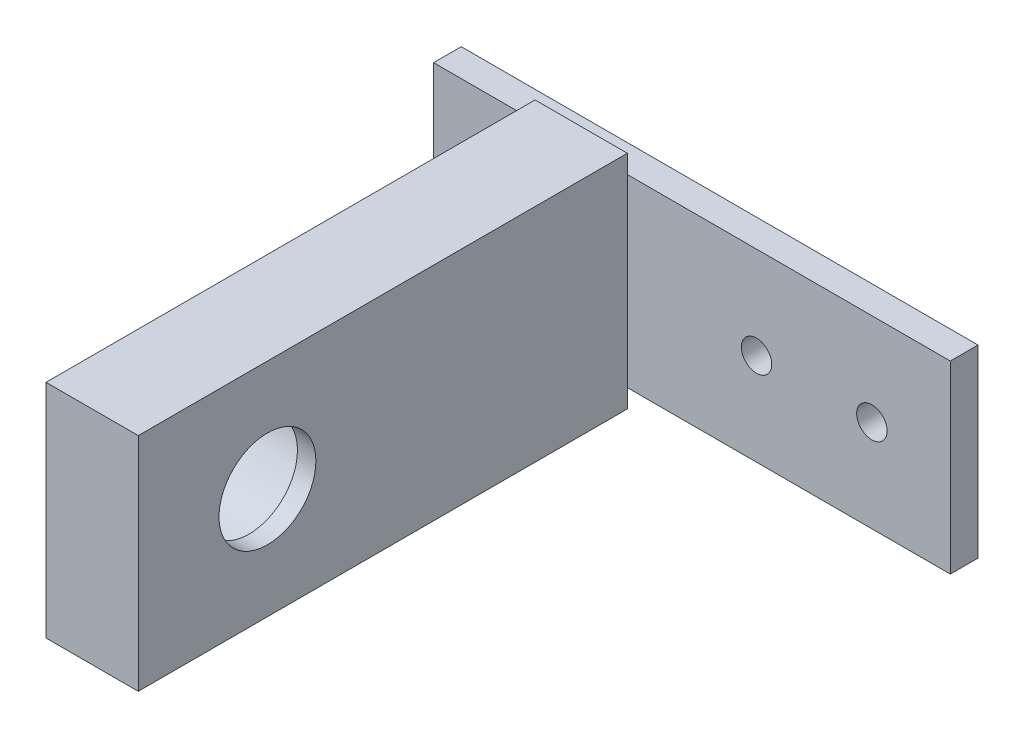
ISO-10303-21;
HEADER;
FILE_DESCRIPTION(('STEP AP214'),'2;1');
FILE_NAME('part.step','',(''),(''),'','','');
FILE_SCHEMA(('AUTOMOTIVE_DESIGN { 1 0 10303 214 1 1 1 1 }'));
ENDSEC;
DATA;
#1=APPLICATION_CONTEXT('core data for automotive mechanical design processes');
#2=APPLICATION_PROTOCOL_DEFINITION('international standard','automotive_design',2000,#1);
#3=PRODUCT_CONTEXT('',#1,'mechanical');
#4=PRODUCT('Part','Part','',(#3));
#5=PRODUCT_RELATED_PRODUCT_CATEGORY('part','',(#4));
#6=PRODUCT_DEFINITION_FORMATION('','',#4);
#7=PRODUCT_DEFINITION_CONTEXT('part definition',#1,'design');
#8=PRODUCT_DEFINITION('design','',#6,#7);
#9=PRODUCT_DEFINITION_SHAPE('','',#8);
#10=(LENGTH_UNIT() NAMED_UNIT(*) SI_UNIT(.MILLI.,.METRE.));
#11=(NAMED_UNIT(*) PLANE_ANGLE_UNIT() SI_UNIT($,.RADIAN.));
#12=(NAMED_UNIT(*) SI_UNIT($,.STERADIAN.) SOLID_ANGLE_UNIT());
#13=UNCERTAINTY_MEASURE_WITH_UNIT(LENGTH_MEASURE(1.E-05),#10,'distance_accuracy_value','');
#14=(GEOMETRIC_REPRESENTATION_CONTEXT(3) GLOBAL_UNCERTAINTY_ASSIGNED_CONTEXT((#13)) GLOBAL_UNIT_ASSIGNED_CONTEXT((#10,
#11,#12)) REPRESENTATION_CONTEXT('',''));
#15=CARTESIAN_POINT('',(0.,0.,0.));
#16=DIRECTION('',(0.,0.,1.));
#17=DIRECTION('',(1.,0.,0.));
#18=AXIS2_PLACEMENT_3D('',#15,#16,#17);
#19=CARTESIAN_POINT('',(12.,24.,0.002299999999991));
#20=DIRECTION('',(0.,0.,1.));
#21=DIRECTION('',(1.,0.,0.));
#22=AXIS2_PLACEMENT_3D('',#19,#20,#21);
#23=CYLINDRICAL_SURFACE('',#22,3.3);
#24=CARTESIAN_POINT('',(12.,24.,0.002299999999991));
#25=DIRECTION('',(0.,0.,1.));
#26=DIRECTION('',(1.,0.,0.));
#27=AXIS2_PLACEMENT_3D('',#24,#25,#26);
#28=CIRCLE('',#27,3.3);
#29=CARTESIAN_POINT('',(15.3,24.,0.002299999999991));
#30=VERTEX_POINT('',#29);
#31=EDGE_CURVE('E19',#30,#30,#28,.F.);
#32=ORIENTED_EDGE('',*,*,#31,.T.);
#33=EDGE_LOOP('',(#32));
#34=FACE_BOUND('',#33,.T.);
#35=CARTESIAN_POINT('',(12.,24.,6.0023));
#36=DIRECTION('',(0.,0.,1.));
#37=DIRECTION('',(1.,0.,0.));
#38=AXIS2_PLACEMENT_3D('',#35,#36,#37);
#39=CIRCLE('',#38,3.3);
#40=CARTESIAN_POINT('',(15.3,24.,6.0023));
#41=VERTEX_POINT('',#40);
#42=EDGE_CURVE('E121',#41,#41,#39,.F.);
#43=ORIENTED_EDGE('',*,*,#42,.F.);
#44=EDGE_LOOP('',(#43));
#45=FACE_BOUND('',#44,.T.);
#46=ADVANCED_FACE('F16',(#34,#45),#23,.F.);
#47=CARTESIAN_POINT('',(30.,44.,64.0023));
#48=DIRECTION('',(1.,0.,0.));
#49=DIRECTION('',(0.,0.,-1.));
#50=AXIS2_PLACEMENT_3D('',#47,#48,#49);
#51=PLANE('',#50);
#52=CARTESIAN_POINT('',(30.,44.,64.0023));
#53=DIRECTION('',(1.,0.,0.));
#54=DIRECTION('',(0.,0.,-1.));
#55=AXIS2_PLACEMENT_3D('',#52,#53,#54);
#56=CIRCLE('',#55,1.5);
#57=CARTESIAN_POINT('',(30.,44.,62.5023));
#58=VERTEX_POINT('',#57);
#59=EDGE_CURVE('E170',#58,#58,#56,.F.);
#60=ORIENTED_EDGE('',*,*,#59,.T.);
#61=EDGE_LOOP('',(#60));
#62=FACE_BOUND('',#61,.T.);
#63=ADVANCED_FACE('F179',(#62),#51,.F.);
#64=CARTESIAN_POINT('',(30.,44.,104.0023));
#65=DIRECTION('',(1.,0.,0.));
#66=DIRECTION('',(0.,0.,-1.));
#67=AXIS2_PLACEMENT_3D('',#64,#65,#66);
#68=PLANE('',#67);
#69=CARTESIAN_POINT('',(30.,44.,104.0023));
#70=DIRECTION('',(1.,0.,0.));
#71=DIRECTION('',(0.,0.,-1.));
#72=AXIS2_PLACEMENT_3D('',#69,#70,#71);
#73=CIRCLE('',#72,1.5);
#74=CARTESIAN_POINT('',(30.,44.,102.5023));
#75=VERTEX_POINT('',#74);
#76=EDGE_CURVE('E167',#75,#75,#73,.F.);
#77=ORIENTED_EDGE('',*,*,#76,.T.);
#78=EDGE_LOOP('',(#77));
#79=FACE_BOUND('',#78,.T.);
#80=ADVANCED_FACE('F185',(#79),#68,.F.);
#81=CARTESIAN_POINT('',(30.,4.,64.0023));
#82=DIRECTION('',(1.,0.,0.));
#83=DIRECTION('',(0.,0.,-1.));
#84=AXIS2_PLACEMENT_3D('',#81,#82,#83);
#85=PLANE('',#84);
#86=CARTESIAN_POINT('',(30.,4.,64.0023));
#87=DIRECTION('',(1.,0.,0.));
#88=DIRECTION('',(0.,0.,-1.));
#89=AXIS2_PLACEMENT_3D('',#86,#87,#88);
#90=CIRCLE('',#89,1.5);
#91=CARTESIAN_POINT('',(30.,4.,62.5023));
#92=VERTEX_POINT('',#91);
#93=EDGE_CURVE('E164',#92,#92,#90,.F.);
#94=ORIENTED_EDGE('',*,*,#93,.T.);
#95=EDGE_LOOP('',(#94));
#96=FACE_BOUND('',#95,.T.);
#97=ADVANCED_FACE('F279',(#96),#85,.F.);
#98=CARTESIAN_POINT('',(30.,4.,104.0023));
#99=DIRECTION('',(1.,0.,0.));
#100=DIRECTION('',(0.,0.,-1.));
#101=AXIS2_PLACEMENT_3D('',#98,#99,#100);
#102=PLANE('',#101);
#103=CARTESIAN_POINT('',(30.,4.,104.0023));
#104=DIRECTION('',(1.,0.,0.));
#105=DIRECTION('',(0.,0.,-1.));
#106=AXIS2_PLACEMENT_3D('',#103,#104,#105);
#107=CIRCLE('',#106,1.5);
#108=CARTESIAN_POINT('',(30.,4.,102.5023));
#109=VERTEX_POINT('',#108);
#110=EDGE_CURVE('E104',#109,#109,#107,.F.);
#111=ORIENTED_EDGE('',*,*,#110,.T.);
#112=EDGE_LOOP('',(#111));
#113=FACE_BOUND('',#112,.T.);
#114=ADVANCED_FACE('F275',(#113),#102,.F.);
#115=CARTESIAN_POINT('',(0.,4.,0.002299999999991));
#116=DIRECTION('',(0.,0.,1.));
#117=DIRECTION('',(1.,0.,0.));
#118=AXIS2_PLACEMENT_3D('',#115,#116,#117);
#119=PLANE('',#118);
#120=CARTESIAN_POINT('',(95.,24.,0.002299999999991));
#121=DIRECTION('',(0.,0.,1.));
#122=DIRECTION('',(1.,0.,0.));
#123=AXIS2_PLACEMENT_3D('',#120,#121,#122);
#124=CIRCLE('',#123,3.3);
#125=CARTESIAN_POINT('',(98.3,24.,0.002299999999991));
#126=VERTEX_POINT('',#125);
#127=EDGE_CURVE('E155',#126,#126,#124,.T.);
#128=ORIENTED_EDGE('',*,*,#127,.T.);
#129=EDGE_LOOP('',(#128));
#130=FACE_BOUND('',#129,.T.);
#131=CARTESIAN_POINT('',(70.,24.,0.002299999999991));
#132=DIRECTION('',(0.,0.,1.));
#133=DIRECTION('',(1.,0.,0.));
#134=AXIS2_PLACEMENT_3D('',#131,#132,#133);
#135=CIRCLE('',#134,3.3);
#136=CARTESIAN_POINT('',(73.3,24.,0.002299999999991));
#137=VERTEX_POINT('',#136);
#138=EDGE_CURVE('E159',#137,#137,#135,.T.);
#139=ORIENTED_EDGE('',*,*,#138,.T.);
#140=EDGE_LOOP('',(#139));
#141=FACE_BOUND('',#140,.T.);
#142=ORIENTED_EDGE('',*,*,#31,.F.);
#143=EDGE_LOOP('',(#142));
#144=FACE_BOUND('',#143,.T.);
#145=DIRECTION('',(0.,1.,0.));
#146=VECTOR('',#145,1.);
#147=CARTESIAN_POINT('',(112.,4.,0.002299999999991));
#148=LINE('',#147,#146);
#149=CARTESIAN_POINT('',(112.,4.,0.002299999999991));
#150=VERTEX_POINT('',#149);
#151=CARTESIAN_POINT('',(112.,44.,0.002299999999991));
#152=VERTEX_POINT('',#151);
#153=EDGE_CURVE('E101',#150,#152,#148,.T.);
#154=ORIENTED_EDGE('',*,*,#153,.F.);
#155=DIRECTION('',(1.,0.,0.));
#156=VECTOR('',#155,1.);
#157=CARTESIAN_POINT('',(0.,4.,0.002299999999991));
#158=LINE('',#157,#156);
#159=CARTESIAN_POINT('',(0.,4.,0.002299999999991));
#160=VERTEX_POINT('',#159);
#161=EDGE_CURVE('E96',#150,#160,#158,.F.);
#162=ORIENTED_EDGE('',*,*,#161,.T.);
#163=DIRECTION('',(0.,1.,0.));
#164=VECTOR('',#163,1.);
#165=CARTESIAN_POINT('',(0.,4.,0.002299999999991));
#166=LINE('',#165,#164);
#167=CARTESIAN_POINT('',(0.,44.,0.002299999999991));
#168=VERTEX_POINT('',#167);
#169=EDGE_CURVE('E98',#160,#168,#166,.T.);
#170=ORIENTED_EDGE('',*,*,#169,.T.);
#171=DIRECTION('',(1.,0.,0.));
#172=VECTOR('',#171,1.);
#173=CARTESIAN_POINT('',(0.,44.,0.002299999999991));
#174=LINE('',#173,#172);
#175=EDGE_CURVE('E158',#152,#168,#174,.F.);
#176=ORIENTED_EDGE('',*,*,#175,.F.);
#177=EDGE_LOOP('',(#154,#162,#170,#176));
#178=FACE_BOUND('',#177,.T.);
#179=ADVANCED_FACE('F97',(#130,#141,#144,#178),#119,.F.);
#180=CARTESIAN_POINT('',(0.,4.,0.002299999999991));
#181=DIRECTION('',(1.,0.,0.));
#182=DIRECTION('',(0.,0.,-1.));
#183=AXIS2_PLACEMENT_3D('',#180,#181,#182);
#184=PLANE('',#183);
#185=DIRECTION('',(0.,0.,1.));
#186=VECTOR('',#185,1.);
#187=CARTESIAN_POINT('',(0.,44.,0.002299999999991));
#188=LINE('',#187,#186);
#189=CARTESIAN_POINT('',(0.,44.,6.0023));
#190=VERTEX_POINT('',#189);
#191=EDGE_CURVE('E108',#168,#190,#188,.T.);
#192=ORIENTED_EDGE('',*,*,#191,.F.);
#193=ORIENTED_EDGE('',*,*,#169,.F.);
#194=DIRECTION('',(0.,0.,1.));
#195=VECTOR('',#194,1.);
#196=CARTESIAN_POINT('',(0.,4.,0.002299999999991));
#197=LINE('',#196,#195);
#198=CARTESIAN_POINT('',(0.,4.,6.0023));
#199=VERTEX_POINT('',#198);
#200=EDGE_CURVE('E91',#160,#199,#197,.T.);
#201=ORIENTED_EDGE('',*,*,#200,.T.);
#202=DIRECTION('',(0.,1.,0.));
#203=VECTOR('',#202,1.);
#204=CARTESIAN_POINT('',(0.,4.,6.0023));
#205=LINE('',#204,#203);
#206=EDGE_CURVE('E110',#190,#199,#205,.F.);
#207=ORIENTED_EDGE('',*,*,#206,.F.);
#208=EDGE_LOOP('',(#192,#193,#201,#207));
#209=FACE_BOUND('',#208,.T.);
#210=ADVANCED_FACE('F106',(#209),#184,.F.);
#211=CARTESIAN_POINT('',(0.,4.,6.0023));
#212=DIRECTION('',(0.,0.,1.));
#213=DIRECTION('',(1.,0.,0.));
#214=AXIS2_PLACEMENT_3D('',#211,#212,#213);
#215=PLANE('',#214);
#216=ORIENTED_EDGE('',*,*,#42,.T.);
#217=EDGE_LOOP('',(#216));
#218=FACE_BOUND('',#217,.T.);
#219=DIRECTION('',(1.,0.,0.));
#220=VECTOR('',#219,1.);
#221=CARTESIAN_POINT('',(0.,4.,6.0023));
#222=LINE('',#221,#220);
#223=CARTESIAN_POINT('',(22.,4.,6.0023));
#224=VERTEX_POINT('',#223);
#225=EDGE_CURVE('E115',#199,#224,#222,.T.);
#226=ORIENTED_EDGE('',*,*,#225,.T.);
#227=DIRECTION('',(0.,1.,0.));
#228=VECTOR('',#227,1.);
#229=CARTESIAN_POINT('',(22.,0.,6.0023));
#230=LINE('',#229,#228);
#231=CARTESIAN_POINT('',(22.,44.,6.0023));
#232=VERTEX_POINT('',#231);
#233=EDGE_CURVE('E154',#224,#232,#230,.T.);
#234=ORIENTED_EDGE('',*,*,#233,.T.);
#235=DIRECTION('',(1.,0.,0.));
#236=VECTOR('',#235,1.);
#237=CARTESIAN_POINT('',(0.,44.,6.0023));
#238=LINE('',#237,#236);
#239=EDGE_CURVE('E499',#190,#232,#238,.T.);
#240=ORIENTED_EDGE('',*,*,#239,.F.);
#241=ORIENTED_EDGE('',*,*,#206,.T.);
#242=EDGE_LOOP('',(#226,#234,#240,#241));
#243=FACE_BOUND('',#242,.T.);
#244=ADVANCED_FACE('F175',(#218,#243),#215,.T.);
#245=CARTESIAN_POINT('',(22.,44.,64.0023));
#246=DIRECTION('',(1.,0.,0.));
#247=DIRECTION('',(0.,0.,-1.));
#248=AXIS2_PLACEMENT_3D('',#245,#246,#247);
#249=CYLINDRICAL_SURFACE('',#248,1.5);
#250=CARTESIAN_POINT('',(22.,44.,64.0023));
#251=DIRECTION('',(1.,0.,0.));
#252=DIRECTION('',(0.,0.,-1.));
#253=AXIS2_PLACEMENT_3D('',#250,#251,#252);
#254=CIRCLE('',#253,1.5);
#255=CARTESIAN_POINT('',(22.,44.,62.5023));
#256=VERTEX_POINT('',#255);
#257=EDGE_CURVE('E151',#256,#256,#254,.F.);
#258=ORIENTED_EDGE('',*,*,#257,.T.);
#259=EDGE_LOOP('',(#258));
#260=FACE_BOUND('',#259,.T.);
#261=ORIENTED_EDGE('',*,*,#59,.F.);
#262=EDGE_LOOP('',(#261));
#263=FACE_BOUND('',#262,.T.);
#264=ADVANCED_FACE('F264',(#260,#263),#249,.F.);
#265=CARTESIAN_POINT('',(22.,44.,104.0023));
#266=DIRECTION('',(1.,0.,0.));
#267=DIRECTION('',(0.,0.,-1.));
#268=AXIS2_PLACEMENT_3D('',#265,#266,#267);
#269=CYLINDRICAL_SURFACE('',#268,1.5);
#270=CARTESIAN_POINT('',(22.,44.,104.0023));
#271=DIRECTION('',(1.,0.,0.));
#272=DIRECTION('',(0.,0.,-1.));
#273=AXIS2_PLACEMENT_3D('',#270,#271,#272);
#274=CIRCLE('',#273,1.5);
#275=CARTESIAN_POINT('',(22.,44.,102.5023));
#276=VERTEX_POINT('',#275);
#277=EDGE_CURVE('E148',#276,#276,#274,.F.);
#278=ORIENTED_EDGE('',*,*,#277,.T.);
#279=EDGE_LOOP('',(#278));
#280=FACE_BOUND('',#279,.T.);
#281=ORIENTED_EDGE('',*,*,#76,.F.);
#282=EDGE_LOOP('',(#281));
#283=FACE_BOUND('',#282,.T.);
#284=ADVANCED_FACE('F260',(#280,#283),#269,.F.);
#285=CARTESIAN_POINT('',(22.,4.,64.0023));
#286=DIRECTION('',(1.,0.,0.));
#287=DIRECTION('',(0.,0.,-1.));
#288=AXIS2_PLACEMENT_3D('',#285,#286,#287);
#289=CYLINDRICAL_SURFACE('',#288,1.5);
#290=CARTESIAN_POINT('',(22.,4.,64.0023));
#291=DIRECTION('',(1.,0.,0.));
#292=DIRECTION('',(0.,0.,-1.));
#293=AXIS2_PLACEMENT_3D('',#290,#291,#292);
#294=CIRCLE('',#293,1.5);
#295=CARTESIAN_POINT('',(22.,4.,62.5023));
#296=VERTEX_POINT('',#295);
#297=EDGE_CURVE('E145',#296,#296,#294,.F.);
#298=ORIENTED_EDGE('',*,*,#297,.T.);
#299=EDGE_LOOP('',(#298));
#300=FACE_BOUND('',#299,.T.);
#301=ORIENTED_EDGE('',*,*,#93,.F.);
#302=EDGE_LOOP('',(#301));
#303=FACE_BOUND('',#302,.T.);
#304=ADVANCED_FACE('F256',(#300,#303),#289,.F.);
#305=CARTESIAN_POINT('',(22.,4.,104.0023));
#306=DIRECTION('',(1.,0.,0.));
#307=DIRECTION('',(0.,0.,-1.));
#308=AXIS2_PLACEMENT_3D('',#305,#306,#307);
#309=CYLINDRICAL_SURFACE('',#308,1.5);
#310=CARTESIAN_POINT('',(22.,4.,104.0023));
#311=DIRECTION('',(1.,0.,0.));
#312=DIRECTION('',(0.,0.,-1.));
#313=AXIS2_PLACEMENT_3D('',#310,#311,#312);
#314=CIRCLE('',#313,1.5);
#315=CARTESIAN_POINT('',(22.,4.,102.5023));
#316=VERTEX_POINT('',#315);
#317=EDGE_CURVE('E139',#316,#316,#314,.F.);
#318=ORIENTED_EDGE('',*,*,#317,.T.);
#319=EDGE_LOOP('',(#318));
#320=FACE_BOUND('',#319,.T.);
#321=ORIENTED_EDGE('',*,*,#110,.F.);
#322=EDGE_LOOP('',(#321));
#323=FACE_BOUND('',#322,.T.);
#324=ADVANCED_FACE('F252',(#320,#323),#309,.F.);
#325=CARTESIAN_POINT('',(22.,24.,84.0023));
#326=DIRECTION('',(1.,0.,0.));
#327=DIRECTION('',(0.,0.,-1.));
#328=AXIS2_PLACEMENT_3D('',#325,#326,#327);
#329=CYLINDRICAL_SURFACE('',#328,17.5);
#330=CARTESIAN_POINT('',(22.,24.,84.0023));
#331=DIRECTION('',(1.,0.,0.));
#332=DIRECTION('',(0.,0.,-1.));
#333=AXIS2_PLACEMENT_3D('',#330,#331,#332);
#334=CIRCLE('',#333,17.5);
#335=CARTESIAN_POINT('',(22.,24.,66.5023));
#336=VERTEX_POINT('',#335);
#337=EDGE_CURVE('E142',#336,#336,#334,.F.);
#338=ORIENTED_EDGE('',*,*,#337,.T.);
#339=EDGE_LOOP('',(#338));
#340=FACE_BOUND('',#339,.T.);
#341=CARTESIAN_POINT('',(38.,24.,84.0023));
#342=DIRECTION('',(1.,0.,0.));
#343=DIRECTION('',(0.,0.,-1.));
#344=AXIS2_PLACEMENT_3D('',#341,#342,#343);
#345=CIRCLE('',#344,17.5);
#346=CARTESIAN_POINT('',(38.,24.,66.5023));
#347=VERTEX_POINT('',#346);
#348=EDGE_CURVE('E135',#347,#347,#345,.T.);
#349=ORIENTED_EDGE('',*,*,#348,.T.);
#350=EDGE_LOOP('',(#349));
#351=FACE_BOUND('',#350,.T.);
#352=ADVANCED_FACE('F249',(#340,#351),#329,.F.);
#353=CARTESIAN_POINT('',(0.,4.,0.002299999999991));
#354=DIRECTION('',(0.,1.,0.));
#355=DIRECTION('',(0.,0.,1.));
#356=AXIS2_PLACEMENT_3D('',#353,#354,#355);
#357=PLANE('',#356);
#358=DIRECTION('',(1.,0.,0.));
#359=VECTOR('',#358,1.);
#360=CARTESIAN_POINT('',(0.,4.,6.0023));
#361=LINE('',#360,#359);
#362=CARTESIAN_POINT('',(42.,4.,6.0023));
#363=VERTEX_POINT('',#362);
#364=CARTESIAN_POINT('',(112.,4.,6.0023));
#365=VERTEX_POINT('',#364);
#366=EDGE_CURVE('E475',#363,#365,#361,.T.);
#367=ORIENTED_EDGE('',*,*,#366,.F.);
#368=DIRECTION('',(1.,0.,0.));
#369=VECTOR('',#368,1.);
#370=CARTESIAN_POINT('',(22.,4.,6.0023));
#371=LINE('',#370,#369);
#372=EDGE_CURVE('E485',#363,#224,#371,.F.);
#373=ORIENTED_EDGE('',*,*,#372,.T.);
#374=ORIENTED_EDGE('',*,*,#225,.F.);
#375=ORIENTED_EDGE('',*,*,#200,.F.);
#376=ORIENTED_EDGE('',*,*,#161,.F.);
#377=DIRECTION('',(0.,0.,-1.));
#378=VECTOR('',#377,1.);
#379=CARTESIAN_POINT('',(112.,4.,0.002299999999991));
#380=LINE('',#379,#378);
#381=EDGE_CURVE('E117',#365,#150,#380,.T.);
#382=ORIENTED_EDGE('',*,*,#381,.F.);
#383=EDGE_LOOP('',(#367,#373,#374,#375,#376,#382));
#384=FACE_BOUND('',#383,.T.);
#385=ADVANCED_FACE('F113',(#384),#357,.F.);
#386=CARTESIAN_POINT('',(112.,4.,0.002299999999991));
#387=DIRECTION('',(1.,0.,0.));
#388=DIRECTION('',(0.,0.,-1.));
#389=AXIS2_PLACEMENT_3D('',#386,#387,#388);
#390=PLANE('',#389);
#391=DIRECTION('',(0.,0.,1.));
#392=VECTOR('',#391,1.);
#393=CARTESIAN_POINT('',(112.,44.,0.002299999999991));
#394=LINE('',#393,#392);
#395=CARTESIAN_POINT('',(112.,44.,6.0023));
#396=VERTEX_POINT('',#395);
#397=EDGE_CURVE('E496',#396,#152,#394,.F.);
#398=ORIENTED_EDGE('',*,*,#397,.F.);
#399=DIRECTION('',(0.,1.,0.));
#400=VECTOR('',#399,1.);
#401=CARTESIAN_POINT('',(112.,4.,6.0023));
#402=LINE('',#401,#400);
#403=EDGE_CURVE('E134',#365,#396,#402,.T.);
#404=ORIENTED_EDGE('',*,*,#403,.F.);
#405=ORIENTED_EDGE('',*,*,#381,.T.);
#406=ORIENTED_EDGE('',*,*,#153,.T.);
#407=EDGE_LOOP('',(#398,#404,#405,#406));
#408=FACE_BOUND('',#407,.T.);
#409=ADVANCED_FACE('F242',(#408),#390,.T.);
#410=CARTESIAN_POINT('',(70.,24.,0.002299999999991));
#411=DIRECTION('',(0.,0.,1.));
#412=DIRECTION('',(1.,0.,0.));
#413=AXIS2_PLACEMENT_3D('',#410,#411,#412);
#414=CYLINDRICAL_SURFACE('',#413,3.3);
#415=ORIENTED_EDGE('',*,*,#138,.F.);
#416=EDGE_LOOP('',(#415));
#417=FACE_BOUND('',#416,.T.);
#418=CARTESIAN_POINT('',(70.,24.,6.0023));
#419=DIRECTION('',(0.,0.,1.));
#420=DIRECTION('',(1.,0.,0.));
#421=AXIS2_PLACEMENT_3D('',#418,#419,#420);
#422=CIRCLE('',#421,3.3);
#423=CARTESIAN_POINT('',(73.3,24.,6.0023));
#424=VERTEX_POINT('',#423);
#425=EDGE_CURVE('E131',#424,#424,#422,.F.);
#426=ORIENTED_EDGE('',*,*,#425,.F.);
#427=EDGE_LOOP('',(#426));
#428=FACE_BOUND('',#427,.T.);
#429=ADVANCED_FACE('F238',(#417,#428),#414,.F.);
#430=CARTESIAN_POINT('',(95.,24.,0.002299999999991));
#431=DIRECTION('',(0.,0.,1.));
#432=DIRECTION('',(1.,0.,0.));
#433=AXIS2_PLACEMENT_3D('',#430,#431,#432);
#434=CYLINDRICAL_SURFACE('',#433,3.3);
#435=ORIENTED_EDGE('',*,*,#127,.F.);
#436=EDGE_LOOP('',(#435));
#437=FACE_BOUND('',#436,.T.);
#438=CARTESIAN_POINT('',(95.,24.,6.0023));
#439=DIRECTION('',(0.,0.,1.));
#440=DIRECTION('',(1.,0.,0.));
#441=AXIS2_PLACEMENT_3D('',#438,#439,#440);
#442=CIRCLE('',#441,3.3);
#443=CARTESIAN_POINT('',(98.3,24.,6.0023));
#444=VERTEX_POINT('',#443);
#445=EDGE_CURVE('E127',#444,#444,#442,.F.);
#446=ORIENTED_EDGE('',*,*,#445,.F.);
#447=EDGE_LOOP('',(#446));
#448=FACE_BOUND('',#447,.T.);
#449=ADVANCED_FACE('F234',(#437,#448),#434,.F.);
#450=CARTESIAN_POINT('',(0.,44.,0.002299999999991));
#451=DIRECTION('',(0.,1.,0.));
#452=DIRECTION('',(0.,0.,1.));
#453=AXIS2_PLACEMENT_3D('',#450,#451,#452);
#454=PLANE('',#453);
#455=DIRECTION('',(1.,0.,0.));
#456=VECTOR('',#455,1.);
#457=CARTESIAN_POINT('',(0.,44.,6.0023));
#458=LINE('',#457,#456);
#459=CARTESIAN_POINT('',(42.,44.,6.0023));
#460=VERTEX_POINT('',#459);
#461=EDGE_CURVE('E482',#396,#460,#458,.F.);
#462=ORIENTED_EDGE('',*,*,#461,.F.);
#463=ORIENTED_EDGE('',*,*,#397,.T.);
#464=ORIENTED_EDGE('',*,*,#175,.T.);
#465=ORIENTED_EDGE('',*,*,#191,.T.);
#466=ORIENTED_EDGE('',*,*,#239,.T.);
#467=DIRECTION('',(1.,0.,0.));
#468=VECTOR('',#467,1.);
#469=CARTESIAN_POINT('',(22.,44.,6.0023));
#470=LINE('',#469,#468);
#471=EDGE_CURVE('E506',#232,#460,#470,.T.);
#472=ORIENTED_EDGE('',*,*,#471,.T.);
#473=EDGE_LOOP('',(#462,#463,#464,#465,#466,#472));
#474=FACE_BOUND('',#473,.T.);
#475=ADVANCED_FACE('F230',(#474),#454,.T.);
#476=CARTESIAN_POINT('',(22.,0.,6.0023));
#477=DIRECTION('',(1.,0.,0.));
#478=DIRECTION('',(0.,0.,-1.));
#479=AXIS2_PLACEMENT_3D('',#476,#477,#478);
#480=PLANE('',#479);
#481=ORIENTED_EDGE('',*,*,#317,.F.);
#482=EDGE_LOOP('',(#481));
#483=FACE_BOUND('',#482,.T.);
#484=ORIENTED_EDGE('',*,*,#337,.F.);
#485=EDGE_LOOP('',(#484));
#486=FACE_BOUND('',#485,.T.);
#487=ORIENTED_EDGE('',*,*,#297,.F.);
#488=EDGE_LOOP('',(#487));
#489=FACE_BOUND('',#488,.T.);
#490=ORIENTED_EDGE('',*,*,#277,.F.);
#491=EDGE_LOOP('',(#490));
#492=FACE_BOUND('',#491,.T.);
#493=ORIENTED_EDGE('',*,*,#257,.F.);
#494=EDGE_LOOP('',(#493));
#495=FACE_BOUND('',#494,.T.);
#496=DIRECTION('',(0.,0.,1.));
#497=VECTOR('',#496,1.);
#498=CARTESIAN_POINT('',(22.,48.,6.0023));
#499=LINE('',#498,#497);
#500=CARTESIAN_POINT('',(22.,48.,6.0023));
#501=VERTEX_POINT('',#500);
#502=CARTESIAN_POINT('',(22.,48.,112.0023));
#503=VERTEX_POINT('',#502);
#504=EDGE_CURVE('E530',#501,#503,#499,.T.);
#505=ORIENTED_EDGE('',*,*,#504,.F.);
#506=DIRECTION('',(0.,1.,0.));
#507=VECTOR('',#506,1.);
#508=CARTESIAN_POINT('',(22.,0.,6.0023));
#509=LINE('',#508,#507);
#510=EDGE_CURVE('E130',#501,#232,#509,.F.);
#511=ORIENTED_EDGE('',*,*,#510,.T.);
#512=ORIENTED_EDGE('',*,*,#233,.F.);
#513=DIRECTION('',(0.,1.,0.));
#514=VECTOR('',#513,1.);
#515=CARTESIAN_POINT('',(22.,0.,6.0023));
#516=LINE('',#515,#514);
#517=CARTESIAN_POINT('',(22.,0.,6.0023));
#518=VERTEX_POINT('',#517);
#519=EDGE_CURVE('E492',#224,#518,#516,.F.);
#520=ORIENTED_EDGE('',*,*,#519,.T.);
#521=DIRECTION('',(0.,0.,1.));
#522=VECTOR('',#521,1.);
#523=CARTESIAN_POINT('',(22.,0.,6.0023));
#524=LINE('',#523,#522);
#525=CARTESIAN_POINT('',(22.,0.,112.0023));
#526=VERTEX_POINT('',#525);
#527=EDGE_CURVE('E138',#518,#526,#524,.T.);
#528=ORIENTED_EDGE('',*,*,#527,.T.);
#529=DIRECTION('',(0.,1.,0.));
#530=VECTOR('',#529,1.);
#531=CARTESIAN_POINT('',(22.,0.,112.0023));
#532=LINE('',#531,#530);
#533=EDGE_CURVE('E527',#503,#526,#532,.F.);
#534=ORIENTED_EDGE('',*,*,#533,.F.);
#535=EDGE_LOOP('',(#505,#511,#512,#520,#528,#534));
#536=FACE_BOUND('',#535,.T.);
#537=ADVANCED_FACE('F226',(#483,#486,#489,#492,#495,#536),#480,.F.);
#538=CARTESIAN_POINT('',(38.,24.,84.0023));
#539=DIRECTION('',(1.,0.,0.));
#540=DIRECTION('',(0.,0.,-1.));
#541=AXIS2_PLACEMENT_3D('',#538,#539,#540);
#542=PLANE('',#541);
#543=CARTESIAN_POINT('',(38.,24.,84.0023));
#544=DIRECTION('',(1.,0.,0.));
#545=DIRECTION('',(0.,0.,-1.));
#546=AXIS2_PLACEMENT_3D('',#543,#544,#545);
#547=CIRCLE('',#546,10.5);
#548=CARTESIAN_POINT('',(38.,24.,73.5023));
#549=VERTEX_POINT('',#548);
#550=EDGE_CURVE('E123',#549,#549,#547,.T.);
#551=ORIENTED_EDGE('',*,*,#550,.T.);
#552=EDGE_LOOP('',(#551));
#553=FACE_BOUND('',#552,.T.);
#554=ORIENTED_EDGE('',*,*,#348,.F.);
#555=EDGE_LOOP('',(#554));
#556=FACE_BOUND('',#555,.T.);
#557=ADVANCED_FACE('F222',(#553,#556),#542,.F.);
#558=CARTESIAN_POINT('',(22.,0.,6.0023));
#559=DIRECTION('',(0.,1.,0.));
#560=DIRECTION('',(0.,0.,1.));
#561=AXIS2_PLACEMENT_3D('',#558,#559,#560);
#562=PLANE('',#561);
#563=DIRECTION('',(1.,0.,0.));
#564=VECTOR('',#563,1.);
#565=CARTESIAN_POINT('',(22.,0.,112.0023));
#566=LINE('',#565,#564);
#567=CARTESIAN_POINT('',(42.,0.,112.0023));
#568=VERTEX_POINT('',#567);
#569=EDGE_CURVE('E524',#526,#568,#566,.T.);
#570=ORIENTED_EDGE('',*,*,#569,.F.);
#571=ORIENTED_EDGE('',*,*,#527,.F.);
#572=DIRECTION('',(1.,0.,0.));
#573=VECTOR('',#572,1.);
#574=CARTESIAN_POINT('',(22.,0.,6.0023));
#575=LINE('',#574,#573);
#576=CARTESIAN_POINT('',(42.,0.,6.0023));
#577=VERTEX_POINT('',#576);
#578=EDGE_CURVE('E490',#518,#577,#575,.T.);
#579=ORIENTED_EDGE('',*,*,#578,.T.);
#580=DIRECTION('',(0.,0.,-1.));
#581=VECTOR('',#580,1.);
#582=CARTESIAN_POINT('',(42.,0.,6.0023));
#583=LINE('',#582,#581);
#584=EDGE_CURVE('E126',#568,#577,#583,.T.);
#585=ORIENTED_EDGE('',*,*,#584,.F.);
#586=EDGE_LOOP('',(#570,#571,#579,#585));
#587=FACE_BOUND('',#586,.T.);
#588=ADVANCED_FACE('F218',(#587),#562,.F.);
#589=CARTESIAN_POINT('',(22.,0.,6.0023));
#590=DIRECTION('',(0.,0.,1.));
#591=DIRECTION('',(1.,0.,0.));
#592=AXIS2_PLACEMENT_3D('',#589,#590,#591);
#593=PLANE('',#592);
#594=DIRECTION('',(0.,1.,0.));
#595=VECTOR('',#594,1.);
#596=CARTESIAN_POINT('',(42.,0.,6.0023));
#597=LINE('',#596,#595);
#598=EDGE_CURVE('E517',#577,#363,#597,.T.);
#599=ORIENTED_EDGE('',*,*,#598,.F.);
#600=ORIENTED_EDGE('',*,*,#578,.F.);
#601=ORIENTED_EDGE('',*,*,#519,.F.);
#602=ORIENTED_EDGE('',*,*,#372,.F.);
#603=EDGE_LOOP('',(#599,#600,#601,#602));
#604=FACE_BOUND('',#603,.T.);
#605=ADVANCED_FACE('F214',(#604),#593,.F.);
#606=CARTESIAN_POINT('',(0.,4.,6.0023));
#607=DIRECTION('',(0.,0.,1.));
#608=DIRECTION('',(1.,0.,0.));
#609=AXIS2_PLACEMENT_3D('',#606,#607,#608);
#610=PLANE('',#609);
#611=ORIENTED_EDGE('',*,*,#445,.T.);
#612=EDGE_LOOP('',(#611));
#613=FACE_BOUND('',#612,.T.);
#614=ORIENTED_EDGE('',*,*,#425,.T.);
#615=EDGE_LOOP('',(#614));
#616=FACE_BOUND('',#615,.T.);
#617=ORIENTED_EDGE('',*,*,#366,.T.);
#618=ORIENTED_EDGE('',*,*,#403,.T.);
#619=ORIENTED_EDGE('',*,*,#461,.T.);
#620=DIRECTION('',(0.,1.,0.));
#621=VECTOR('',#620,1.);
#622=CARTESIAN_POINT('',(42.,0.,6.0023));
#623=LINE('',#622,#621);
#624=EDGE_CURVE('E479',#363,#460,#623,.T.);
#625=ORIENTED_EDGE('',*,*,#624,.F.);
#626=EDGE_LOOP('',(#617,#618,#619,#625));
#627=FACE_BOUND('',#626,.T.);
#628=ADVANCED_FACE('F210',(#613,#616,#627),#610,.T.);
#629=CARTESIAN_POINT('',(22.,0.,6.0023));
#630=DIRECTION('',(0.,0.,1.));
#631=DIRECTION('',(1.,0.,0.));
#632=AXIS2_PLACEMENT_3D('',#629,#630,#631);
#633=PLANE('',#632);
#634=DIRECTION('',(0.,1.,0.));
#635=VECTOR('',#634,1.);
#636=CARTESIAN_POINT('',(42.,0.,6.0023));
#637=LINE('',#636,#635);
#638=CARTESIAN_POINT('',(42.,48.,6.0023));
#639=VERTEX_POINT('',#638);
#640=EDGE_CURVE('E509',#460,#639,#637,.T.);
#641=ORIENTED_EDGE('',*,*,#640,.F.);
#642=ORIENTED_EDGE('',*,*,#471,.F.);
#643=ORIENTED_EDGE('',*,*,#510,.F.);
#644=DIRECTION('',(1.,0.,0.));
#645=VECTOR('',#644,1.);
#646=CARTESIAN_POINT('',(22.,48.,6.0023));
#647=LINE('',#646,#645);
#648=EDGE_CURVE('E511',#639,#501,#647,.F.);
#649=ORIENTED_EDGE('',*,*,#648,.F.);
#650=EDGE_LOOP('',(#641,#642,#643,#649));
#651=FACE_BOUND('',#650,.T.);
#652=ADVANCED_FACE('F207',(#651),#633,.F.);
#653=CARTESIAN_POINT('',(22.,48.,6.0023));
#654=DIRECTION('',(0.,1.,0.));
#655=DIRECTION('',(0.,0.,1.));
#656=AXIS2_PLACEMENT_3D('',#653,#654,#655);
#657=PLANE('',#656);
#658=DIRECTION('',(1.,0.,0.));
#659=VECTOR('',#658,1.);
#660=CARTESIAN_POINT('',(22.,48.,112.0023));
#661=LINE('',#660,#659);
#662=CARTESIAN_POINT('',(42.,48.,112.0023));
#663=VERTEX_POINT('',#662);
#664=EDGE_CURVE('E34',#663,#503,#661,.F.);
#665=ORIENTED_EDGE('',*,*,#664,.F.);
#666=DIRECTION('',(0.,0.,-1.));
#667=VECTOR('',#666,1.);
#668=CARTESIAN_POINT('',(42.,48.,6.0023));
#669=LINE('',#668,#667);
#670=EDGE_CURVE('E513',#639,#663,#669,.F.);
#671=ORIENTED_EDGE('',*,*,#670,.F.);
#672=ORIENTED_EDGE('',*,*,#648,.T.);
#673=ORIENTED_EDGE('',*,*,#504,.T.);
#674=EDGE_LOOP('',(#665,#671,#672,#673));
#675=FACE_BOUND('',#674,.T.);
#676=ADVANCED_FACE('F203',(#675),#657,.T.);
#677=CARTESIAN_POINT('',(22.,0.,112.0023));
#678=DIRECTION('',(0.,0.,1.));
#679=DIRECTION('',(1.,0.,0.));
#680=AXIS2_PLACEMENT_3D('',#677,#678,#679);
#681=PLANE('',#680);
#682=DIRECTION('',(0.,1.,0.));
#683=VECTOR('',#682,1.);
#684=CARTESIAN_POINT('',(42.,0.,112.0023));
#685=LINE('',#684,#683);
#686=EDGE_CURVE('E25',#663,#568,#685,.F.);
#687=ORIENTED_EDGE('',*,*,#686,.F.);
#688=ORIENTED_EDGE('',*,*,#664,.T.);
#689=ORIENTED_EDGE('',*,*,#533,.T.);
#690=ORIENTED_EDGE('',*,*,#569,.T.);
#691=EDGE_LOOP('',(#687,#688,#689,#690));
#692=FACE_BOUND('',#691,.T.);
#693=ADVANCED_FACE('F196',(#692),#681,.T.);
#694=CARTESIAN_POINT('',(22.,24.,84.0023));
#695=DIRECTION('',(1.,0.,0.));
#696=DIRECTION('',(0.,0.,-1.));
#697=AXIS2_PLACEMENT_3D('',#694,#695,#696);
#698=CYLINDRICAL_SURFACE('',#697,10.5);
#699=CARTESIAN_POINT('',(42.,24.,84.0023));
#700=DIRECTION('',(1.,0.,0.));
#701=DIRECTION('',(0.,0.,-1.));
#702=AXIS2_PLACEMENT_3D('',#699,#700,#701);
#703=CIRCLE('',#702,10.5);
#704=CARTESIAN_POINT('',(42.,24.,73.5023));
#705=VERTEX_POINT('',#704);
#706=EDGE_CURVE('E11',#705,#705,#703,.F.);
#707=ORIENTED_EDGE('',*,*,#706,.F.);
#708=EDGE_LOOP('',(#707));
#709=FACE_BOUND('',#708,.T.);
#710=ORIENTED_EDGE('',*,*,#550,.F.);
#711=EDGE_LOOP('',(#710));
#712=FACE_BOUND('',#711,.T.);
#713=ADVANCED_FACE('F190',(#709,#712),#698,.F.);
#714=CARTESIAN_POINT('',(42.,0.,6.0023));
#715=DIRECTION('',(1.,0.,0.));
#716=DIRECTION('',(0.,0.,-1.));
#717=AXIS2_PLACEMENT_3D('',#714,#715,#716);
#718=PLANE('',#717);
#719=ORIENTED_EDGE('',*,*,#706,.T.);
#720=EDGE_LOOP('',(#719));
#721=FACE_BOUND('',#720,.T.);
#722=ORIENTED_EDGE('',*,*,#670,.T.);
#723=ORIENTED_EDGE('',*,*,#686,.T.);
#724=ORIENTED_EDGE('',*,*,#584,.T.);
#725=ORIENTED_EDGE('',*,*,#598,.T.);
#726=ORIENTED_EDGE('',*,*,#624,.T.);
#727=ORIENTED_EDGE('',*,*,#640,.T.);
#728=EDGE_LOOP('',(#722,#723,#724,#725,#726,#727));
#729=FACE_BOUND('',#728,.T.);
#730=ADVANCED_FACE('F188',(#721,#729),#718,.T.);
#731=CLOSED_SHELL('',(#46,#63,#80,#97,#114,#179,#210,#244,#264,#284,#304,#324,#352,#385,#409,
#429,#449,#475,#537,#557,#588,#605,#628,#652,#676,#693,#713,#730));
#732=MANIFOLD_SOLID_BREP('B1',#731);
#733=ADVANCED_BREP_SHAPE_REPRESENTATION('',(#18,#732),#14);
#734=SHAPE_DEFINITION_REPRESENTATION(#9,#733);
ENDSEC;
END-ISO-10303-21;
